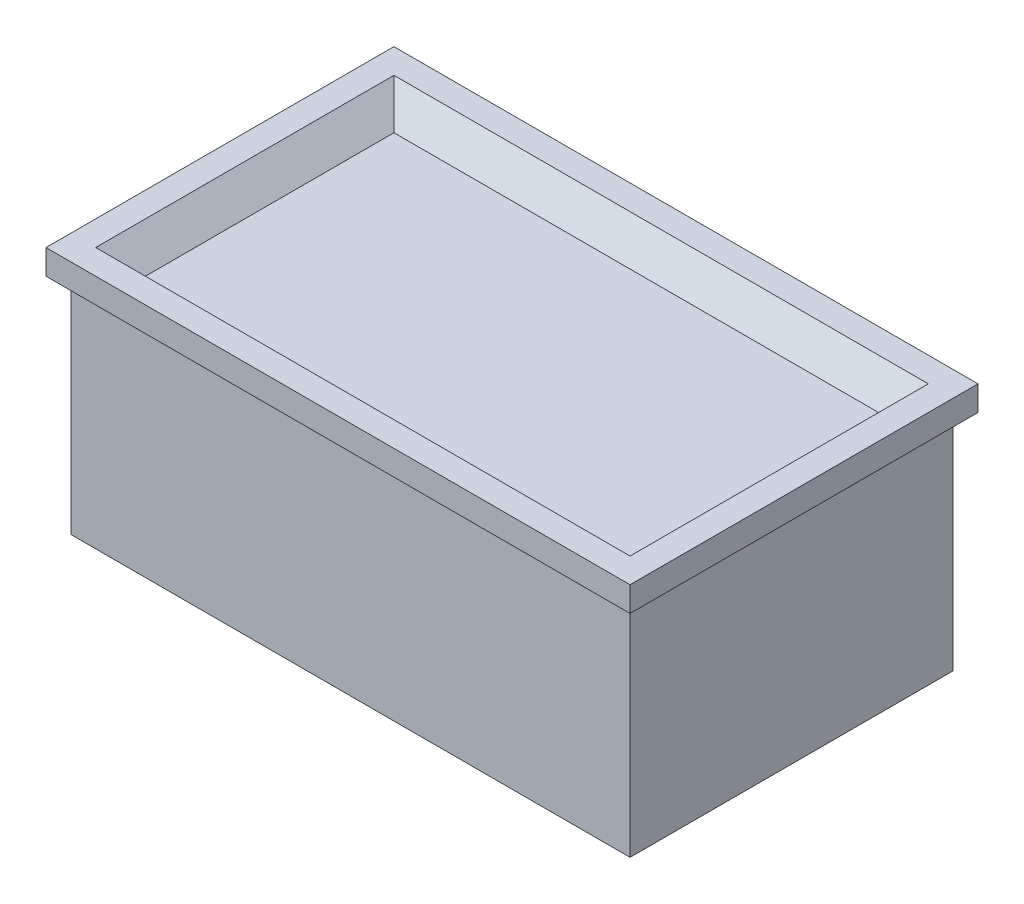
ISO-10303-21;
HEADER;
FILE_DESCRIPTION(('STEP AP214'),'2;1');
FILE_NAME('part.step','',(''),(''),'','','');
FILE_SCHEMA(('AUTOMOTIVE_DESIGN { 1 0 10303 214 1 1 1 1 }'));
ENDSEC;
DATA;
#1=APPLICATION_CONTEXT('core data for automotive mechanical design processes');
#2=APPLICATION_PROTOCOL_DEFINITION('international standard','automotive_design',2000,#1);
#3=PRODUCT_CONTEXT('',#1,'mechanical');
#4=PRODUCT('Part','Part','',(#3));
#5=PRODUCT_RELATED_PRODUCT_CATEGORY('part','',(#4));
#6=PRODUCT_DEFINITION_FORMATION('','',#4);
#7=PRODUCT_DEFINITION_CONTEXT('part definition',#1,'design');
#8=PRODUCT_DEFINITION('design','',#6,#7);
#9=PRODUCT_DEFINITION_SHAPE('','',#8);
#10=(LENGTH_UNIT() NAMED_UNIT(*) SI_UNIT(.MILLI.,.METRE.));
#11=(NAMED_UNIT(*) PLANE_ANGLE_UNIT() SI_UNIT($,.RADIAN.));
#12=(NAMED_UNIT(*) SI_UNIT($,.STERADIAN.) SOLID_ANGLE_UNIT());
#13=UNCERTAINTY_MEASURE_WITH_UNIT(LENGTH_MEASURE(1.E-05),#10,'distance_accuracy_value','');
#14=(GEOMETRIC_REPRESENTATION_CONTEXT(3) GLOBAL_UNCERTAINTY_ASSIGNED_CONTEXT((#13)) GLOBAL_UNIT_ASSIGNED_CONTEXT((#10,
#11,#12)) REPRESENTATION_CONTEXT('',''));
#15=CARTESIAN_POINT('',(0.,0.,0.));
#16=DIRECTION('',(0.,0.,1.));
#17=DIRECTION('',(1.,0.,0.));
#18=AXIS2_PLACEMENT_3D('',#15,#16,#17);
#19=CARTESIAN_POINT('',(-22.5,18.,13.));
#20=DIRECTION('',(1.,0.,0.));
#21=DIRECTION('',(0.,0.,-1.));
#22=AXIS2_PLACEMENT_3D('',#19,#20,#21);
#23=PLANE('',#22);
#24=DIRECTION('',(0.,0.,1.));
#25=VECTOR('',#24,1.);
#26=CARTESIAN_POINT('',(-22.5,0.,13.));
#27=LINE('',#26,#25);
#28=CARTESIAN_POINT('',(-22.5,0.,-13.));
#29=VERTEX_POINT('',#28);
#30=CARTESIAN_POINT('',(-22.5,0.,13.));
#31=VERTEX_POINT('',#30);
#32=EDGE_CURVE('E170',#29,#31,#27,.T.);
#33=ORIENTED_EDGE('',*,*,#32,.T.);
#34=DIRECTION('',(0.,-1.,0.));
#35=VECTOR('',#34,1.);
#36=CARTESIAN_POINT('',(-22.5,18.,13.));
#37=LINE('',#36,#35);
#38=CARTESIAN_POINT('',(-22.5,18.,13.));
#39=VERTEX_POINT('',#38);
#40=EDGE_CURVE('E150',#39,#31,#37,.T.);
#41=ORIENTED_EDGE('',*,*,#40,.F.);
#42=DIRECTION('',(0.,0.,1.));
#43=VECTOR('',#42,1.);
#44=CARTESIAN_POINT('',(-22.5,18.,13.));
#45=LINE('',#44,#43);
#46=CARTESIAN_POINT('',(-22.5,18.,-13.));
#47=VERTEX_POINT('',#46);
#48=EDGE_CURVE('E165',#47,#39,#45,.T.);
#49=ORIENTED_EDGE('',*,*,#48,.F.);
#50=DIRECTION('',(0.,-1.,0.));
#51=VECTOR('',#50,1.);
#52=CARTESIAN_POINT('',(-22.5,18.,-13.));
#53=LINE('',#52,#51);
#54=EDGE_CURVE('E159',#47,#29,#53,.T.);
#55=ORIENTED_EDGE('',*,*,#54,.T.);
#56=EDGE_LOOP('',(#33,#41,#49,#55));
#57=FACE_BOUND('',#56,.T.);
#58=ADVANCED_FACE('F34',(#57),#23,.F.);
#59=CARTESIAN_POINT('',(22.5,18.,13.));
#60=DIRECTION('',(0.,0.,-1.));
#61=DIRECTION('',(-1.,0.,0.));
#62=AXIS2_PLACEMENT_3D('',#59,#60,#61);
#63=PLANE('',#62);
#64=DIRECTION('',(1.,0.,0.));
#65=VECTOR('',#64,1.);
#66=CARTESIAN_POINT('',(22.5,0.,13.));
#67=LINE('',#66,#65);
#68=CARTESIAN_POINT('',(22.5,0.,13.));
#69=VERTEX_POINT('',#68);
#70=EDGE_CURVE('E168',#31,#69,#67,.T.);
#71=ORIENTED_EDGE('',*,*,#70,.T.);
#72=DIRECTION('',(0.,-1.,0.));
#73=VECTOR('',#72,1.);
#74=CARTESIAN_POINT('',(22.5,18.,13.));
#75=LINE('',#74,#73);
#76=CARTESIAN_POINT('',(22.5,18.,13.));
#77=VERTEX_POINT('',#76);
#78=EDGE_CURVE('E153',#77,#69,#75,.T.);
#79=ORIENTED_EDGE('',*,*,#78,.F.);
#80=DIRECTION('',(1.,0.,0.));
#81=VECTOR('',#80,1.);
#82=CARTESIAN_POINT('',(22.5,18.,13.));
#83=LINE('',#82,#81);
#84=EDGE_CURVE('E179',#39,#77,#83,.T.);
#85=ORIENTED_EDGE('',*,*,#84,.F.);
#86=ORIENTED_EDGE('',*,*,#40,.T.);
#87=EDGE_LOOP('',(#71,#79,#85,#86));
#88=FACE_BOUND('',#87,.T.);
#89=ADVANCED_FACE('F260',(#88),#63,.F.);
#90=CARTESIAN_POINT('',(22.5,18.,13.));
#91=DIRECTION('',(-1.,0.,0.));
#92=DIRECTION('',(0.,0.,1.));
#93=AXIS2_PLACEMENT_3D('',#90,#91,#92);
#94=PLANE('',#93);
#95=DIRECTION('',(0.,0.,-1.));
#96=VECTOR('',#95,1.);
#97=CARTESIAN_POINT('',(22.5,0.,13.));
#98=LINE('',#97,#96);
#99=CARTESIAN_POINT('',(22.5,0.,-13.));
#100=VERTEX_POINT('',#99);
#101=EDGE_CURVE('E166',#69,#100,#98,.T.);
#102=ORIENTED_EDGE('',*,*,#101,.T.);
#103=DIRECTION('',(0.,-1.,0.));
#104=VECTOR('',#103,1.);
#105=CARTESIAN_POINT('',(22.5,18.,-13.));
#106=LINE('',#105,#104);
#107=CARTESIAN_POINT('',(22.5,18.,-13.));
#108=VERTEX_POINT('',#107);
#109=EDGE_CURVE('E156',#108,#100,#106,.T.);
#110=ORIENTED_EDGE('',*,*,#109,.F.);
#111=DIRECTION('',(0.,0.,-1.));
#112=VECTOR('',#111,1.);
#113=CARTESIAN_POINT('',(22.5,18.,13.));
#114=LINE('',#113,#112);
#115=EDGE_CURVE('E176',#77,#108,#114,.T.);
#116=ORIENTED_EDGE('',*,*,#115,.F.);
#117=ORIENTED_EDGE('',*,*,#78,.T.);
#118=EDGE_LOOP('',(#102,#110,#116,#117));
#119=FACE_BOUND('',#118,.T.);
#120=ADVANCED_FACE('F262',(#119),#94,.F.);
#121=CARTESIAN_POINT('',(22.5,18.,-13.));
#122=DIRECTION('',(0.,0.,1.));
#123=DIRECTION('',(1.,0.,0.));
#124=AXIS2_PLACEMENT_3D('',#121,#122,#123);
#125=PLANE('',#124);
#126=DIRECTION('',(-1.,0.,0.));
#127=VECTOR('',#126,1.);
#128=CARTESIAN_POINT('',(22.5,0.,-13.));
#129=LINE('',#128,#127);
#130=EDGE_CURVE('E163',#100,#29,#129,.T.);
#131=ORIENTED_EDGE('',*,*,#130,.T.);
#132=ORIENTED_EDGE('',*,*,#54,.F.);
#133=DIRECTION('',(-1.,0.,0.));
#134=VECTOR('',#133,1.);
#135=CARTESIAN_POINT('',(22.5,18.,-13.));
#136=LINE('',#135,#134);
#137=EDGE_CURVE('E162',#108,#47,#136,.T.);
#138=ORIENTED_EDGE('',*,*,#137,.F.);
#139=ORIENTED_EDGE('',*,*,#109,.T.);
#140=EDGE_LOOP('',(#131,#132,#138,#139));
#141=FACE_BOUND('',#140,.T.);
#142=ADVANCED_FACE('F252',(#141),#125,.F.);
#143=CARTESIAN_POINT('',(0.,0.,0.));
#144=DIRECTION('',(0.,1.,0.));
#145=DIRECTION('',(0.,0.,1.));
#146=AXIS2_PLACEMENT_3D('',#143,#144,#145);
#147=PLANE('',#146);
#148=ORIENTED_EDGE('',*,*,#32,.F.);
#149=ORIENTED_EDGE('',*,*,#130,.F.);
#150=ORIENTED_EDGE('',*,*,#101,.F.);
#151=ORIENTED_EDGE('',*,*,#70,.F.);
#152=EDGE_LOOP('',(#148,#149,#150,#151));
#153=FACE_BOUND('',#152,.T.);
#154=ADVANCED_FACE('F246',(#153),#147,.F.);
#155=CARTESIAN_POINT('',(0.,18.,0.));
#156=DIRECTION('',(0.,1.,0.));
#157=DIRECTION('',(0.,0.,1.));
#158=AXIS2_PLACEMENT_3D('',#155,#156,#157);
#159=PLANE('',#158);
#160=DIRECTION('',(0.,0.,-1.));
#161=VECTOR('',#160,1.);
#162=CARTESIAN_POINT('',(23.5,18.,14.));
#163=LINE('',#162,#161);
#164=CARTESIAN_POINT('',(23.5,18.,14.));
#165=VERTEX_POINT('',#164);
#166=CARTESIAN_POINT('',(23.5,18.,-14.));
#167=VERTEX_POINT('',#166);
#168=EDGE_CURVE('E203',#165,#167,#163,.T.);
#169=ORIENTED_EDGE('',*,*,#168,.F.);
#170=DIRECTION('',(-1.,0.,0.));
#171=VECTOR('',#170,1.);
#172=CARTESIAN_POINT('',(23.5,18.,14.));
#173=LINE('',#172,#171);
#174=CARTESIAN_POINT('',(-23.5,18.,14.));
#175=VERTEX_POINT('',#174);
#176=EDGE_CURVE('E193',#165,#175,#173,.T.);
#177=ORIENTED_EDGE('',*,*,#176,.T.);
#178=DIRECTION('',(0.,0.,-1.));
#179=VECTOR('',#178,1.);
#180=CARTESIAN_POINT('',(-23.5,18.,14.));
#181=LINE('',#180,#179);
#182=CARTESIAN_POINT('',(-23.5,18.,-14.));
#183=VERTEX_POINT('',#182);
#184=EDGE_CURVE('E197',#175,#183,#181,.T.);
#185=ORIENTED_EDGE('',*,*,#184,.T.);
#186=DIRECTION('',(-1.,0.,0.));
#187=VECTOR('',#186,1.);
#188=CARTESIAN_POINT('',(23.5,18.,-14.));
#189=LINE('',#188,#187);
#190=EDGE_CURVE('E200',#167,#183,#189,.T.);
#191=ORIENTED_EDGE('',*,*,#190,.F.);
#192=EDGE_LOOP('',(#169,#177,#185,#191));
#193=FACE_BOUND('',#192,.T.);
#194=ORIENTED_EDGE('',*,*,#137,.T.);
#195=ORIENTED_EDGE('',*,*,#48,.T.);
#196=ORIENTED_EDGE('',*,*,#84,.T.);
#197=ORIENTED_EDGE('',*,*,#115,.T.);
#198=EDGE_LOOP('',(#194,#195,#196,#197));
#199=FACE_BOUND('',#198,.T.);
#200=ADVANCED_FACE('F243',(#193,#199),#159,.F.);
#201=CARTESIAN_POINT('',(23.5,20.,14.));
#202=DIRECTION('',(-1.,0.,0.));
#203=DIRECTION('',(0.,0.,1.));
#204=AXIS2_PLACEMENT_3D('',#201,#202,#203);
#205=PLANE('',#204);
#206=ORIENTED_EDGE('',*,*,#168,.T.);
#207=DIRECTION('',(0.,-1.,0.));
#208=VECTOR('',#207,1.);
#209=CARTESIAN_POINT('',(23.5,20.,-14.));
#210=LINE('',#209,#208);
#211=CARTESIAN_POINT('',(23.5,20.,-14.));
#212=VERTEX_POINT('',#211);
#213=EDGE_CURVE('E173',#212,#167,#210,.T.);
#214=ORIENTED_EDGE('',*,*,#213,.F.);
#215=DIRECTION('',(0.,0.,-1.));
#216=VECTOR('',#215,1.);
#217=CARTESIAN_POINT('',(23.5,20.,14.));
#218=LINE('',#217,#216);
#219=CARTESIAN_POINT('',(23.5,20.,14.));
#220=VERTEX_POINT('',#219);
#221=EDGE_CURVE('E196',#220,#212,#218,.T.);
#222=ORIENTED_EDGE('',*,*,#221,.F.);
#223=DIRECTION('',(0.,-1.,0.));
#224=VECTOR('',#223,1.);
#225=CARTESIAN_POINT('',(23.5,20.,14.));
#226=LINE('',#225,#224);
#227=EDGE_CURVE('E190',#220,#165,#226,.T.);
#228=ORIENTED_EDGE('',*,*,#227,.T.);
#229=EDGE_LOOP('',(#206,#214,#222,#228));
#230=FACE_BOUND('',#229,.T.);
#231=ADVANCED_FACE('F233',(#230),#205,.F.);
#232=CARTESIAN_POINT('',(23.5,20.,-14.));
#233=DIRECTION('',(0.,0.,1.));
#234=DIRECTION('',(1.,0.,0.));
#235=AXIS2_PLACEMENT_3D('',#232,#233,#234);
#236=PLANE('',#235);
#237=ORIENTED_EDGE('',*,*,#190,.T.);
#238=DIRECTION('',(0.,-1.,0.));
#239=VECTOR('',#238,1.);
#240=CARTESIAN_POINT('',(-23.5,20.,-14.));
#241=LINE('',#240,#239);
#242=CARTESIAN_POINT('',(-23.5,20.,-14.));
#243=VERTEX_POINT('',#242);
#244=EDGE_CURVE('E186',#243,#183,#241,.T.);
#245=ORIENTED_EDGE('',*,*,#244,.F.);
#246=DIRECTION('',(-1.,0.,0.));
#247=VECTOR('',#246,1.);
#248=CARTESIAN_POINT('',(23.5,20.,-14.));
#249=LINE('',#248,#247);
#250=EDGE_CURVE('E211',#212,#243,#249,.T.);
#251=ORIENTED_EDGE('',*,*,#250,.F.);
#252=ORIENTED_EDGE('',*,*,#213,.T.);
#253=EDGE_LOOP('',(#237,#245,#251,#252));
#254=FACE_BOUND('',#253,.T.);
#255=ADVANCED_FACE('F236',(#254),#236,.F.);
#256=CARTESIAN_POINT('',(-23.5,20.,14.));
#257=DIRECTION('',(-1.,0.,0.));
#258=DIRECTION('',(0.,0.,1.));
#259=AXIS2_PLACEMENT_3D('',#256,#257,#258);
#260=PLANE('',#259);
#261=ORIENTED_EDGE('',*,*,#184,.F.);
#262=DIRECTION('',(0.,-1.,0.));
#263=VECTOR('',#262,1.);
#264=CARTESIAN_POINT('',(-23.5,20.,14.));
#265=LINE('',#264,#263);
#266=CARTESIAN_POINT('',(-23.5,20.,14.));
#267=VERTEX_POINT('',#266);
#268=EDGE_CURVE('E188',#267,#175,#265,.T.);
#269=ORIENTED_EDGE('',*,*,#268,.F.);
#270=DIRECTION('',(0.,0.,-1.));
#271=VECTOR('',#270,1.);
#272=CARTESIAN_POINT('',(-23.5,20.,14.));
#273=LINE('',#272,#271);
#274=EDGE_CURVE('E208',#267,#243,#273,.T.);
#275=ORIENTED_EDGE('',*,*,#274,.T.);
#276=ORIENTED_EDGE('',*,*,#244,.T.);
#277=EDGE_LOOP('',(#261,#269,#275,#276));
#278=FACE_BOUND('',#277,.T.);
#279=ADVANCED_FACE('F239',(#278),#260,.T.);
#280=CARTESIAN_POINT('',(23.5,20.,14.));
#281=DIRECTION('',(0.,0.,1.));
#282=DIRECTION('',(1.,0.,0.));
#283=AXIS2_PLACEMENT_3D('',#280,#281,#282);
#284=PLANE('',#283);
#285=ORIENTED_EDGE('',*,*,#176,.F.);
#286=ORIENTED_EDGE('',*,*,#227,.F.);
#287=DIRECTION('',(-1.,0.,0.));
#288=VECTOR('',#287,1.);
#289=CARTESIAN_POINT('',(23.5,20.,14.));
#290=LINE('',#289,#288);
#291=EDGE_CURVE('E192',#220,#267,#290,.T.);
#292=ORIENTED_EDGE('',*,*,#291,.T.);
#293=ORIENTED_EDGE('',*,*,#268,.T.);
#294=EDGE_LOOP('',(#285,#286,#292,#293));
#295=FACE_BOUND('',#294,.T.);
#296=ADVANCED_FACE('F225',(#295),#284,.T.);
#297=CARTESIAN_POINT('',(0.,20.,0.));
#298=DIRECTION('',(0.,1.,0.));
#299=DIRECTION('',(0.,0.,1.));
#300=AXIS2_PLACEMENT_3D('',#297,#298,#299);
#301=PLANE('',#300);
#302=DIRECTION('',(-1.,0.,0.));
#303=VECTOR('',#302,1.);
#304=CARTESIAN_POINT('',(-19.5,20.,12.));
#305=LINE('',#304,#303);
#306=CARTESIAN_POINT('',(21.5,20.,12.));
#307=VERTEX_POINT('',#306);
#308=CARTESIAN_POINT('',(-21.5,20.,12.));
#309=VERTEX_POINT('',#308);
#310=EDGE_CURVE('E43',#307,#309,#305,.T.);
#311=ORIENTED_EDGE('',*,*,#310,.T.);
#312=DIRECTION('',(0.,0.,-1.));
#313=VECTOR('',#312,1.);
#314=CARTESIAN_POINT('',(-21.5,20.,-10.));
#315=LINE('',#314,#313);
#316=CARTESIAN_POINT('',(-21.5,20.,-12.));
#317=VERTEX_POINT('',#316);
#318=EDGE_CURVE('E11',#309,#317,#315,.T.);
#319=ORIENTED_EDGE('',*,*,#318,.T.);
#320=DIRECTION('',(1.,0.,0.));
#321=VECTOR('',#320,1.);
#322=CARTESIAN_POINT('',(19.5,20.,-12.));
#323=LINE('',#322,#321);
#324=CARTESIAN_POINT('',(21.5,20.,-12.));
#325=VERTEX_POINT('',#324);
#326=EDGE_CURVE('E148',#317,#325,#323,.T.);
#327=ORIENTED_EDGE('',*,*,#326,.T.);
#328=DIRECTION('',(0.,0.,1.));
#329=VECTOR('',#328,1.);
#330=CARTESIAN_POINT('',(21.5,20.,10.));
#331=LINE('',#330,#329);
#332=EDGE_CURVE('E54',#325,#307,#331,.T.);
#333=ORIENTED_EDGE('',*,*,#332,.T.);
#334=EDGE_LOOP('',(#311,#319,#327,#333));
#335=FACE_BOUND('',#334,.T.);
#336=ORIENTED_EDGE('',*,*,#221,.T.);
#337=ORIENTED_EDGE('',*,*,#250,.T.);
#338=ORIENTED_EDGE('',*,*,#274,.F.);
#339=ORIENTED_EDGE('',*,*,#291,.F.);
#340=EDGE_LOOP('',(#336,#337,#338,#339));
#341=FACE_BOUND('',#340,.T.);
#342=ADVANCED_FACE('F222',(#335,#341),#301,.T.);
#343=CARTESIAN_POINT('',(0.,18.,0.));
#344=DIRECTION('',(0.,1.,0.));
#345=DIRECTION('',(0.,0.,1.));
#346=AXIS2_PLACEMENT_3D('',#343,#344,#345);
#347=PLANE('',#346);
#348=DIRECTION('',(1.,0.,0.));
#349=VECTOR('',#348,1.);
#350=CARTESIAN_POINT('',(-19.5,18.,10.));
#351=LINE('',#350,#349);
#352=CARTESIAN_POINT('',(-19.5,18.,10.));
#353=VERTEX_POINT('',#352);
#354=CARTESIAN_POINT('',(19.5,18.,10.));
#355=VERTEX_POINT('',#354);
#356=EDGE_CURVE('E123',#353,#355,#351,.T.);
#357=ORIENTED_EDGE('',*,*,#356,.T.);
#358=DIRECTION('',(0.,0.,-1.));
#359=VECTOR('',#358,1.);
#360=CARTESIAN_POINT('',(19.5,18.,10.));
#361=LINE('',#360,#359);
#362=CARTESIAN_POINT('',(19.5,18.,-10.));
#363=VERTEX_POINT('',#362);
#364=EDGE_CURVE('E126',#355,#363,#361,.T.);
#365=ORIENTED_EDGE('',*,*,#364,.T.);
#366=DIRECTION('',(-1.,0.,0.));
#367=VECTOR('',#366,1.);
#368=CARTESIAN_POINT('',(19.5,18.,-10.));
#369=LINE('',#368,#367);
#370=CARTESIAN_POINT('',(-19.5,18.,-10.));
#371=VERTEX_POINT('',#370);
#372=EDGE_CURVE('E138',#363,#371,#369,.T.);
#373=ORIENTED_EDGE('',*,*,#372,.T.);
#374=DIRECTION('',(0.,0.,1.));
#375=VECTOR('',#374,1.);
#376=CARTESIAN_POINT('',(-19.5,18.,-10.));
#377=LINE('',#376,#375);
#378=EDGE_CURVE('E129',#371,#353,#377,.T.);
#379=ORIENTED_EDGE('',*,*,#378,.T.);
#380=EDGE_LOOP('',(#357,#365,#373,#379));
#381=FACE_BOUND('',#380,.T.);
#382=ADVANCED_FACE('F125',(#381),#347,.T.);
#383=CARTESIAN_POINT('',(19.5,18.,10.));
#384=DIRECTION('',(-0.707106781186549,0.707106781186546,0.));
#385=DIRECTION('',(0.,0.,1.));
#386=AXIS2_PLACEMENT_3D('',#383,#384,#385);
#387=PLANE('',#386);
#388=DIRECTION('',(0.577350269189625,0.577350269189627,0.577350269189625));
#389=VECTOR('',#388,1.);
#390=CARTESIAN_POINT('',(6.50000000000003,4.99999999999998,-2.99999999999996));
#391=LINE('',#390,#389);
#392=EDGE_CURVE('E135',#307,#355,#391,.F.);
#393=ORIENTED_EDGE('',*,*,#392,.F.);
#394=ORIENTED_EDGE('',*,*,#332,.F.);
#395=DIRECTION('',(0.577350269189625,0.577350269189627,-0.577350269189625));
#396=VECTOR('',#395,1.);
#397=CARTESIAN_POINT('',(12.8333333333333,11.3333333333333,-3.33333333333334));
#398=LINE('',#397,#396);
#399=EDGE_CURVE('E38',#363,#325,#398,.T.);
#400=ORIENTED_EDGE('',*,*,#399,.F.);
#401=ORIENTED_EDGE('',*,*,#364,.F.);
#402=EDGE_LOOP('',(#393,#394,#400,#401));
#403=FACE_BOUND('',#402,.T.);
#404=ADVANCED_FACE('F36',(#403),#387,.T.);
#405=CARTESIAN_POINT('',(19.5,18.,-10.));
#406=DIRECTION('',(0.,0.707106781186546,0.707106781186549));
#407=DIRECTION('',(1.,0.,0.));
#408=AXIS2_PLACEMENT_3D('',#405,#406,#407);
#409=PLANE('',#408);
#410=ORIENTED_EDGE('',*,*,#399,.T.);
#411=ORIENTED_EDGE('',*,*,#326,.F.);
#412=DIRECTION('',(0.577350269189625,-0.577350269189627,0.577350269189625));
#413=VECTOR('',#412,1.);
#414=CARTESIAN_POINT('',(-19.5,18.,-10.));
#415=LINE('',#414,#413);
#416=EDGE_CURVE('E141',#371,#317,#415,.F.);
#417=ORIENTED_EDGE('',*,*,#416,.F.);
#418=ORIENTED_EDGE('',*,*,#372,.F.);
#419=EDGE_LOOP('',(#410,#411,#417,#418));
#420=FACE_BOUND('',#419,.T.);
#421=ADVANCED_FACE('F219',(#420),#409,.T.);
#422=CARTESIAN_POINT('',(-19.5,18.,10.));
#423=DIRECTION('',(0.,0.707106781186546,-0.707106781186549));
#424=DIRECTION('',(-1.,0.,0.));
#425=AXIS2_PLACEMENT_3D('',#422,#423,#424);
#426=PLANE('',#425);
#427=ORIENTED_EDGE('',*,*,#392,.T.);
#428=ORIENTED_EDGE('',*,*,#356,.F.);
#429=DIRECTION('',(-0.577350269189625,0.577350269189627,0.577350269189625));
#430=VECTOR('',#429,1.);
#431=CARTESIAN_POINT('',(-12.8333333333333,11.3333333333333,3.33333333333335));
#432=LINE('',#431,#430);
#433=EDGE_CURVE('E142',#309,#353,#432,.F.);
#434=ORIENTED_EDGE('',*,*,#433,.F.);
#435=ORIENTED_EDGE('',*,*,#310,.F.);
#436=EDGE_LOOP('',(#427,#428,#434,#435));
#437=FACE_BOUND('',#436,.T.);
#438=ADVANCED_FACE('F140',(#437),#426,.T.);
#439=CARTESIAN_POINT('',(-19.5,18.,-10.));
#440=DIRECTION('',(0.707106781186549,0.707106781186546,0.));
#441=DIRECTION('',(0.,0.,-1.));
#442=AXIS2_PLACEMENT_3D('',#439,#440,#441);
#443=PLANE('',#442);
#444=ORIENTED_EDGE('',*,*,#416,.T.);
#445=ORIENTED_EDGE('',*,*,#318,.F.);
#446=ORIENTED_EDGE('',*,*,#433,.T.);
#447=ORIENTED_EDGE('',*,*,#378,.F.);
#448=EDGE_LOOP('',(#444,#445,#446,#447));
#449=FACE_BOUND('',#448,.T.);
#450=ADVANCED_FACE('F221',(#449),#443,.T.);
#451=CLOSED_SHELL('',(#58,#89,#120,#142,#154,#200,#231,#255,#279,#296,#342,#382,#404,#421,#438,#450));
#452=MANIFOLD_SOLID_BREP('B2',#451);
#453=ADVANCED_BREP_SHAPE_REPRESENTATION('',(#18,#452),#14);
#454=SHAPE_DEFINITION_REPRESENTATION(#9,#453);
ENDSEC;
END-ISO-10303-21;
